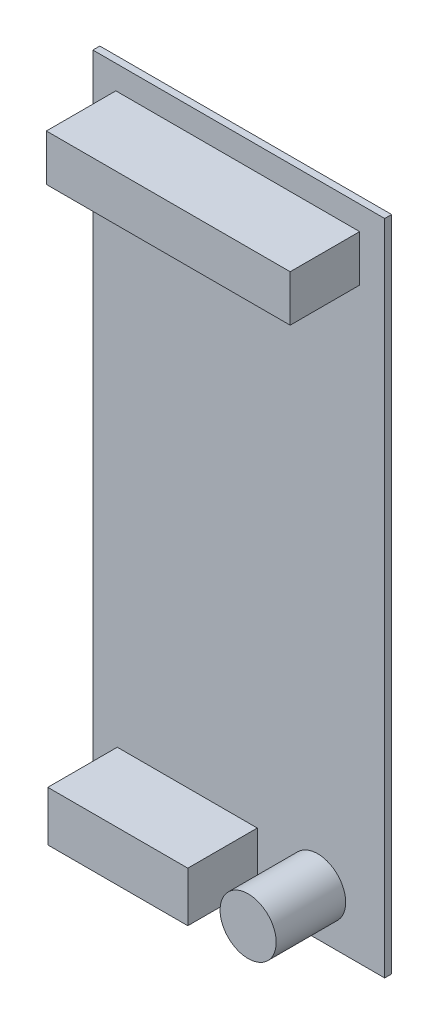
ISO-10303-21;
HEADER;
FILE_DESCRIPTION(('STEP AP214'),'2;1');
FILE_NAME('part.step','',(''),(''),'','','');
FILE_SCHEMA(('AUTOMOTIVE_DESIGN { 1 0 10303 214 1 1 1 1 }'));
ENDSEC;
DATA;
#1=APPLICATION_CONTEXT('core data for automotive mechanical design processes');
#2=APPLICATION_PROTOCOL_DEFINITION('international standard','automotive_design',2000,#1);
#3=PRODUCT_CONTEXT('',#1,'mechanical');
#4=PRODUCT('Part','Part','',(#3));
#5=PRODUCT_RELATED_PRODUCT_CATEGORY('part','',(#4));
#6=PRODUCT_DEFINITION_FORMATION('','',#4);
#7=PRODUCT_DEFINITION_CONTEXT('part definition',#1,'design');
#8=PRODUCT_DEFINITION('design','',#6,#7);
#9=PRODUCT_DEFINITION_SHAPE('','',#8);
#10=(LENGTH_UNIT() NAMED_UNIT(*) SI_UNIT(.MILLI.,.METRE.));
#11=(NAMED_UNIT(*) PLANE_ANGLE_UNIT() SI_UNIT($,.RADIAN.));
#12=(NAMED_UNIT(*) SI_UNIT($,.STERADIAN.) SOLID_ANGLE_UNIT());
#13=UNCERTAINTY_MEASURE_WITH_UNIT(LENGTH_MEASURE(1.E-05),#10,'distance_accuracy_value','');
#14=(GEOMETRIC_REPRESENTATION_CONTEXT(3) GLOBAL_UNCERTAINTY_ASSIGNED_CONTEXT((#13)) GLOBAL_UNIT_ASSIGNED_CONTEXT((#10,
#11,#12)) REPRESENTATION_CONTEXT('',''));
#15=CARTESIAN_POINT('',(0.,0.,0.));
#16=DIRECTION('',(0.,0.,1.));
#17=DIRECTION('',(1.,0.,0.));
#18=AXIS2_PLACEMENT_3D('',#15,#16,#17);
#19=CARTESIAN_POINT('',(0.,0.,0.75));
#20=DIRECTION('',(0.,0.,1.));
#21=DIRECTION('',(1.,0.,0.));
#22=AXIS2_PLACEMENT_3D('',#19,#20,#21);
#23=PLANE('',#22);
#24=CARTESIAN_POINT('',(17.0231668238773,-61.057583046866,0.75));
#25=DIRECTION('',(0.,0.,1.));
#26=DIRECTION('',(1.,0.,0.));
#27=AXIS2_PLACEMENT_3D('',#24,#25,#26);
#28=CIRCLE('',#27,6.05981782966599);
#29=CARTESIAN_POINT('',(23.0829846535433,-61.057583046866,0.75));
#30=VERTEX_POINT('',#29);
#31=EDGE_CURVE('E448',#30,#30,#28,.T.);
#32=ORIENTED_EDGE('',*,*,#31,.F.);
#33=EDGE_LOOP('',(#32));
#34=FACE_BOUND('',#33,.T.);
#35=DIRECTION('',(0.,1.,0.));
#36=VECTOR('',#35,1.);
#37=CARTESIAN_POINT('',(31.5,71.,0.75));
#38=LINE('',#37,#36);
#39=CARTESIAN_POINT('',(31.5,-71.,0.75));
#40=VERTEX_POINT('',#39);
#41=CARTESIAN_POINT('',(31.5,71.,0.75));
#42=VERTEX_POINT('',#41);
#43=EDGE_CURVE('E224',#40,#42,#38,.T.);
#44=ORIENTED_EDGE('',*,*,#43,.T.);
#45=DIRECTION('',(-1.,0.,0.));
#46=VECTOR('',#45,1.);
#47=CARTESIAN_POINT('',(-31.5,71.,0.75));
#48=LINE('',#47,#46);
#49=CARTESIAN_POINT('',(-31.5,71.,0.75));
#50=VERTEX_POINT('',#49);
#51=EDGE_CURVE('E228',#42,#50,#48,.T.);
#52=ORIENTED_EDGE('',*,*,#51,.T.);
#53=DIRECTION('',(0.,-1.,0.));
#54=VECTOR('',#53,1.);
#55=CARTESIAN_POINT('',(-31.5,71.,0.75));
#56=LINE('',#55,#54);
#57=CARTESIAN_POINT('',(-31.5,-71.,0.75));
#58=VERTEX_POINT('',#57);
#59=EDGE_CURVE('E232',#50,#58,#56,.T.);
#60=ORIENTED_EDGE('',*,*,#59,.T.);
#61=DIRECTION('',(1.,0.,0.));
#62=VECTOR('',#61,1.);
#63=CARTESIAN_POINT('',(-31.5,-71.,0.75));
#64=LINE('',#63,#62);
#65=EDGE_CURVE('E235',#58,#40,#64,.T.);
#66=ORIENTED_EDGE('',*,*,#65,.T.);
#67=EDGE_LOOP('',(#44,#52,#60,#66));
#68=FACE_BOUND('',#67,.T.);
#69=DIRECTION('',(1.,0.,0.));
#70=VECTOR('',#69,1.);
#71=CARTESIAN_POINT('',(-26.5363876193413,55.8464095293525,0.75));
#72=LINE('',#71,#70);
#73=CARTESIAN_POINT('',(-26.5363876193413,55.8464095293525,0.75));
#74=VERTEX_POINT('',#73);
#75=CARTESIAN_POINT('',(26.0964649075446,55.8464095293525,0.75));
#76=VERTEX_POINT('',#75);
#77=EDGE_CURVE('E184',#74,#76,#72,.T.);
#78=ORIENTED_EDGE('',*,*,#77,.F.);
#79=DIRECTION('',(0.,-1.,0.));
#80=VECTOR('',#79,1.);
#81=CARTESIAN_POINT('',(-26.5363876193413,65.8464095293525,0.75));
#82=LINE('',#81,#80);
#83=CARTESIAN_POINT('',(-26.5363876193413,65.8464095293525,0.75));
#84=VERTEX_POINT('',#83);
#85=EDGE_CURVE('E180',#84,#74,#82,.T.);
#86=ORIENTED_EDGE('',*,*,#85,.F.);
#87=DIRECTION('',(-1.,0.,0.));
#88=VECTOR('',#87,1.);
#89=CARTESIAN_POINT('',(-26.5363876193413,65.8464095293525,0.75));
#90=LINE('',#89,#88);
#91=CARTESIAN_POINT('',(26.0964649075446,65.8464095293525,0.75));
#92=VERTEX_POINT('',#91);
#93=EDGE_CURVE('E195',#92,#84,#90,.T.);
#94=ORIENTED_EDGE('',*,*,#93,.F.);
#95=DIRECTION('',(0.,1.,0.));
#96=VECTOR('',#95,1.);
#97=CARTESIAN_POINT('',(26.0964649075446,65.8464095293525,0.75));
#98=LINE('',#97,#96);
#99=EDGE_CURVE('E206',#76,#92,#98,.T.);
#100=ORIENTED_EDGE('',*,*,#99,.F.);
#101=EDGE_LOOP('',(#78,#86,#94,#100));
#102=FACE_BOUND('',#101,.T.);
#103=DIRECTION('',(1.,0.,0.));
#104=VECTOR('',#103,1.);
#105=CARTESIAN_POINT('',(-26.2295733714844,-67.4846970517992,0.75));
#106=LINE('',#105,#104);
#107=CARTESIAN_POINT('',(-26.2295733714844,-67.4846970517992,0.75));
#108=VERTEX_POINT('',#107);
#109=CARTESIAN_POINT('',(3.99523303009364,-67.4846970517992,0.75));
#110=VERTEX_POINT('',#109);
#111=EDGE_CURVE('E460',#108,#110,#106,.T.);
#112=ORIENTED_EDGE('',*,*,#111,.F.);
#113=DIRECTION('',(0.,-1.,0.));
#114=VECTOR('',#113,1.);
#115=CARTESIAN_POINT('',(-26.2295733714844,-56.7149384489381,0.75));
#116=LINE('',#115,#114);
#117=CARTESIAN_POINT('',(-26.2295733714844,-56.7149384489381,0.75));
#118=VERTEX_POINT('',#117);
#119=EDGE_CURVE('E178',#118,#108,#116,.T.);
#120=ORIENTED_EDGE('',*,*,#119,.F.);
#121=DIRECTION('',(-1.,0.,0.));
#122=VECTOR('',#121,1.);
#123=CARTESIAN_POINT('',(-26.2295733714844,-56.7149384489381,0.75));
#124=LINE('',#123,#122);
#125=CARTESIAN_POINT('',(3.99523303009364,-56.7149384489381,0.75));
#126=VERTEX_POINT('',#125);
#127=EDGE_CURVE('E174',#126,#118,#124,.T.);
#128=ORIENTED_EDGE('',*,*,#127,.F.);
#129=DIRECTION('',(0.,1.,0.));
#130=VECTOR('',#129,1.);
#131=CARTESIAN_POINT('',(3.99523303009364,-56.7149384489381,0.75));
#132=LINE('',#131,#130);
#133=EDGE_CURVE('E463',#110,#126,#132,.T.);
#134=ORIENTED_EDGE('',*,*,#133,.F.);
#135=EDGE_LOOP('',(#112,#120,#128,#134));
#136=FACE_BOUND('',#135,.T.);
#137=ADVANCED_FACE('F47',(#34,#68,#102,#136),#23,.T.);
#138=CARTESIAN_POINT('',(31.5,71.,0.75));
#139=DIRECTION('',(-1.,0.,0.));
#140=DIRECTION('',(0.,-1.,0.));
#141=AXIS2_PLACEMENT_3D('',#138,#139,#140);
#142=PLANE('',#141);
#143=DIRECTION('',(0.,1.,0.));
#144=VECTOR('',#143,1.);
#145=CARTESIAN_POINT('',(31.5,71.,-0.75));
#146=LINE('',#145,#144);
#147=CARTESIAN_POINT('',(31.5,-71.,-0.75));
#148=VERTEX_POINT('',#147);
#149=CARTESIAN_POINT('',(31.5,71.,-0.75));
#150=VERTEX_POINT('',#149);
#151=EDGE_CURVE('E223',#148,#150,#146,.T.);
#152=ORIENTED_EDGE('',*,*,#151,.T.);
#153=DIRECTION('',(0.,0.,-1.));
#154=VECTOR('',#153,1.);
#155=CARTESIAN_POINT('',(31.5,71.,0.75));
#156=LINE('',#155,#154);
#157=EDGE_CURVE('E11',#42,#150,#156,.T.);
#158=ORIENTED_EDGE('',*,*,#157,.F.);
#159=ORIENTED_EDGE('',*,*,#43,.F.);
#160=DIRECTION('',(0.,0.,-1.));
#161=VECTOR('',#160,1.);
#162=CARTESIAN_POINT('',(31.5,-71.,0.75));
#163=LINE('',#162,#161);
#164=EDGE_CURVE('E238',#40,#148,#163,.T.);
#165=ORIENTED_EDGE('',*,*,#164,.T.);
#166=EDGE_LOOP('',(#152,#158,#159,#165));
#167=FACE_BOUND('',#166,.T.);
#168=ADVANCED_FACE('F49',(#167),#142,.F.);
#169=CARTESIAN_POINT('',(-31.5,71.,0.75));
#170=DIRECTION('',(0.,-1.,0.));
#171=DIRECTION('',(0.,0.,-1.));
#172=AXIS2_PLACEMENT_3D('',#169,#170,#171);
#173=PLANE('',#172);
#174=DIRECTION('',(-1.,0.,0.));
#175=VECTOR('',#174,1.);
#176=CARTESIAN_POINT('',(-31.5,71.,-0.75));
#177=LINE('',#176,#175);
#178=CARTESIAN_POINT('',(-31.5,71.,-0.75));
#179=VERTEX_POINT('',#178);
#180=EDGE_CURVE('E242',#150,#179,#177,.T.);
#181=ORIENTED_EDGE('',*,*,#180,.T.);
#182=DIRECTION('',(0.,0.,-1.));
#183=VECTOR('',#182,1.);
#184=CARTESIAN_POINT('',(-31.5,71.,0.75));
#185=LINE('',#184,#183);
#186=EDGE_CURVE('E56',#50,#179,#185,.T.);
#187=ORIENTED_EDGE('',*,*,#186,.F.);
#188=ORIENTED_EDGE('',*,*,#51,.F.);
#189=ORIENTED_EDGE('',*,*,#157,.T.);
#190=EDGE_LOOP('',(#181,#187,#188,#189));
#191=FACE_BOUND('',#190,.T.);
#192=ADVANCED_FACE('F276',(#191),#173,.F.);
#193=CARTESIAN_POINT('',(-31.5,71.,0.75));
#194=DIRECTION('',(1.,0.,0.));
#195=DIRECTION('',(0.,1.,0.));
#196=AXIS2_PLACEMENT_3D('',#193,#194,#195);
#197=PLANE('',#196);
#198=DIRECTION('',(0.,-1.,0.));
#199=VECTOR('',#198,1.);
#200=CARTESIAN_POINT('',(-31.5,71.,-0.75));
#201=LINE('',#200,#199);
#202=CARTESIAN_POINT('',(-31.5,-71.,-0.75));
#203=VERTEX_POINT('',#202);
#204=EDGE_CURVE('E245',#179,#203,#201,.T.);
#205=ORIENTED_EDGE('',*,*,#204,.T.);
#206=DIRECTION('',(0.,0.,-1.));
#207=VECTOR('',#206,1.);
#208=CARTESIAN_POINT('',(-31.5,-71.,0.75));
#209=LINE('',#208,#207);
#210=EDGE_CURVE('E253',#58,#203,#209,.T.);
#211=ORIENTED_EDGE('',*,*,#210,.F.);
#212=ORIENTED_EDGE('',*,*,#59,.F.);
#213=ORIENTED_EDGE('',*,*,#186,.T.);
#214=EDGE_LOOP('',(#205,#211,#212,#213));
#215=FACE_BOUND('',#214,.T.);
#216=ADVANCED_FACE('F260',(#215),#197,.F.);
#217=CARTESIAN_POINT('',(-31.5,-71.,0.75));
#218=DIRECTION('',(0.,1.,0.));
#219=DIRECTION('',(0.,0.,1.));
#220=AXIS2_PLACEMENT_3D('',#217,#218,#219);
#221=PLANE('',#220);
#222=DIRECTION('',(1.,0.,0.));
#223=VECTOR('',#222,1.);
#224=CARTESIAN_POINT('',(-31.5,-71.,-0.75));
#225=LINE('',#224,#223);
#226=EDGE_CURVE('E229',#203,#148,#225,.T.);
#227=ORIENTED_EDGE('',*,*,#226,.T.);
#228=ORIENTED_EDGE('',*,*,#164,.F.);
#229=ORIENTED_EDGE('',*,*,#65,.F.);
#230=ORIENTED_EDGE('',*,*,#210,.T.);
#231=EDGE_LOOP('',(#227,#228,#229,#230));
#232=FACE_BOUND('',#231,.T.);
#233=ADVANCED_FACE('F269',(#232),#221,.F.);
#234=CARTESIAN_POINT('',(0.,0.,-0.75));
#235=DIRECTION('',(0.,0.,1.));
#236=DIRECTION('',(1.,0.,0.));
#237=AXIS2_PLACEMENT_3D('',#234,#235,#236);
#238=PLANE('',#237);
#239=ORIENTED_EDGE('',*,*,#151,.F.);
#240=ORIENTED_EDGE('',*,*,#226,.F.);
#241=ORIENTED_EDGE('',*,*,#204,.F.);
#242=ORIENTED_EDGE('',*,*,#180,.F.);
#243=EDGE_LOOP('',(#239,#240,#241,#242));
#244=FACE_BOUND('',#243,.T.);
#245=ADVANCED_FACE('F266',(#244),#238,.F.);
#246=CARTESIAN_POINT('',(-26.5363876193413,65.8464095293525,15.75));
#247=DIRECTION('',(1.,0.,0.));
#248=DIRECTION('',(0.,0.,-1.));
#249=AXIS2_PLACEMENT_3D('',#246,#247,#248);
#250=PLANE('',#249);
#251=ORIENTED_EDGE('',*,*,#85,.T.);
#252=DIRECTION('',(0.,0.,-1.));
#253=VECTOR('',#252,1.);
#254=CARTESIAN_POINT('',(-26.5363876193413,55.8464095293525,15.75));
#255=LINE('',#254,#253);
#256=CARTESIAN_POINT('',(-26.5363876193413,55.8464095293525,15.75));
#257=VERTEX_POINT('',#256);
#258=EDGE_CURVE('E220',#257,#74,#255,.T.);
#259=ORIENTED_EDGE('',*,*,#258,.F.);
#260=DIRECTION('',(0.,-1.,0.));
#261=VECTOR('',#260,1.);
#262=CARTESIAN_POINT('',(-26.5363876193413,65.8464095293525,15.75));
#263=LINE('',#262,#261);
#264=CARTESIAN_POINT('',(-26.5363876193413,65.8464095293525,15.75));
#265=VERTEX_POINT('',#264);
#266=EDGE_CURVE('E190',#265,#257,#263,.T.);
#267=ORIENTED_EDGE('',*,*,#266,.F.);
#268=DIRECTION('',(0.,0.,-1.));
#269=VECTOR('',#268,1.);
#270=CARTESIAN_POINT('',(-26.5363876193413,65.8464095293525,15.75));
#271=LINE('',#270,#269);
#272=EDGE_CURVE('E202',#265,#84,#271,.T.);
#273=ORIENTED_EDGE('',*,*,#272,.T.);
#274=EDGE_LOOP('',(#251,#259,#267,#273));
#275=FACE_BOUND('',#274,.T.);
#276=ADVANCED_FACE('F292',(#275),#250,.F.);
#277=CARTESIAN_POINT('',(-26.5363876193413,55.8464095293525,15.75));
#278=DIRECTION('',(0.,1.,0.));
#279=DIRECTION('',(0.,0.,1.));
#280=AXIS2_PLACEMENT_3D('',#277,#278,#279);
#281=PLANE('',#280);
#282=ORIENTED_EDGE('',*,*,#77,.T.);
#283=DIRECTION('',(0.,0.,-1.));
#284=VECTOR('',#283,1.);
#285=CARTESIAN_POINT('',(26.0964649075446,55.8464095293525,15.75));
#286=LINE('',#285,#284);
#287=CARTESIAN_POINT('',(26.0964649075446,55.8464095293525,15.75));
#288=VERTEX_POINT('',#287);
#289=EDGE_CURVE('E216',#288,#76,#286,.T.);
#290=ORIENTED_EDGE('',*,*,#289,.F.);
#291=DIRECTION('',(1.,0.,0.));
#292=VECTOR('',#291,1.);
#293=CARTESIAN_POINT('',(-26.5363876193413,55.8464095293525,15.75));
#294=LINE('',#293,#292);
#295=EDGE_CURVE('E194',#257,#288,#294,.T.);
#296=ORIENTED_EDGE('',*,*,#295,.F.);
#297=ORIENTED_EDGE('',*,*,#258,.T.);
#298=EDGE_LOOP('',(#282,#290,#296,#297));
#299=FACE_BOUND('',#298,.T.);
#300=ADVANCED_FACE('F314',(#299),#281,.F.);
#301=CARTESIAN_POINT('',(26.0964649075446,65.8464095293525,15.75));
#302=DIRECTION('',(-1.,0.,0.));
#303=DIRECTION('',(0.,0.,1.));
#304=AXIS2_PLACEMENT_3D('',#301,#302,#303);
#305=PLANE('',#304);
#306=ORIENTED_EDGE('',*,*,#99,.T.);
#307=DIRECTION('',(0.,0.,-1.));
#308=VECTOR('',#307,1.);
#309=CARTESIAN_POINT('',(26.0964649075446,65.8464095293525,15.75));
#310=LINE('',#309,#308);
#311=CARTESIAN_POINT('',(26.0964649075446,65.8464095293525,15.75));
#312=VERTEX_POINT('',#311);
#313=EDGE_CURVE('E77',#312,#92,#310,.T.);
#314=ORIENTED_EDGE('',*,*,#313,.F.);
#315=DIRECTION('',(0.,1.,0.));
#316=VECTOR('',#315,1.);
#317=CARTESIAN_POINT('',(26.0964649075446,65.8464095293525,15.75));
#318=LINE('',#317,#316);
#319=EDGE_CURVE('E198',#288,#312,#318,.T.);
#320=ORIENTED_EDGE('',*,*,#319,.F.);
#321=ORIENTED_EDGE('',*,*,#289,.T.);
#322=EDGE_LOOP('',(#306,#314,#320,#321));
#323=FACE_BOUND('',#322,.T.);
#324=ADVANCED_FACE('F308',(#323),#305,.F.);
#325=CARTESIAN_POINT('',(-26.5363876193413,65.8464095293525,15.75));
#326=DIRECTION('',(0.,-1.,0.));
#327=DIRECTION('',(0.,0.,-1.));
#328=AXIS2_PLACEMENT_3D('',#325,#326,#327);
#329=PLANE('',#328);
#330=ORIENTED_EDGE('',*,*,#93,.T.);
#331=ORIENTED_EDGE('',*,*,#272,.F.);
#332=DIRECTION('',(-1.,0.,0.));
#333=VECTOR('',#332,1.);
#334=CARTESIAN_POINT('',(-26.5363876193413,65.8464095293525,15.75));
#335=LINE('',#334,#333);
#336=EDGE_CURVE('E200',#312,#265,#335,.T.);
#337=ORIENTED_EDGE('',*,*,#336,.F.);
#338=ORIENTED_EDGE('',*,*,#313,.T.);
#339=EDGE_LOOP('',(#330,#331,#337,#338));
#340=FACE_BOUND('',#339,.T.);
#341=ADVANCED_FACE('F304',(#340),#329,.F.);
#342=CARTESIAN_POINT('',(0.,0.,15.75));
#343=DIRECTION('',(0.,0.,1.));
#344=DIRECTION('',(1.,0.,0.));
#345=AXIS2_PLACEMENT_3D('',#342,#343,#344);
#346=PLANE('',#345);
#347=ORIENTED_EDGE('',*,*,#266,.T.);
#348=ORIENTED_EDGE('',*,*,#295,.T.);
#349=ORIENTED_EDGE('',*,*,#319,.T.);
#350=ORIENTED_EDGE('',*,*,#336,.T.);
#351=EDGE_LOOP('',(#347,#348,#349,#350));
#352=FACE_BOUND('',#351,.T.);
#353=ADVANCED_FACE('F307',(#352),#346,.T.);
#354=CARTESIAN_POINT('',(-26.2295733714844,-56.7149384489381,15.75));
#355=DIRECTION('',(1.,0.,0.));
#356=DIRECTION('',(0.,0.,-1.));
#357=AXIS2_PLACEMENT_3D('',#354,#355,#356);
#358=PLANE('',#357);
#359=ORIENTED_EDGE('',*,*,#119,.T.);
#360=DIRECTION('',(0.,0.,-1.));
#361=VECTOR('',#360,1.);
#362=CARTESIAN_POINT('',(-26.2295733714844,-67.4846970517992,15.75));
#363=LINE('',#362,#361);
#364=CARTESIAN_POINT('',(-26.2295733714844,-67.4846970517992,15.75));
#365=VERTEX_POINT('',#364);
#366=EDGE_CURVE('E157',#365,#108,#363,.T.);
#367=ORIENTED_EDGE('',*,*,#366,.F.);
#368=DIRECTION('',(0.,-1.,0.));
#369=VECTOR('',#368,1.);
#370=CARTESIAN_POINT('',(-26.2295733714844,-56.7149384489381,15.75));
#371=LINE('',#370,#369);
#372=CARTESIAN_POINT('',(-26.2295733714844,-56.7149384489381,15.75));
#373=VERTEX_POINT('',#372);
#374=EDGE_CURVE('E165',#373,#365,#371,.T.);
#375=ORIENTED_EDGE('',*,*,#374,.F.);
#376=DIRECTION('',(0.,0.,-1.));
#377=VECTOR('',#376,1.);
#378=CARTESIAN_POINT('',(-26.2295733714844,-56.7149384489381,15.75));
#379=LINE('',#378,#377);
#380=EDGE_CURVE('E458',#373,#118,#379,.T.);
#381=ORIENTED_EDGE('',*,*,#380,.T.);
#382=EDGE_LOOP('',(#359,#367,#375,#381));
#383=FACE_BOUND('',#382,.T.);
#384=ADVANCED_FACE('F176',(#383),#358,.F.);
#385=CARTESIAN_POINT('',(-26.2295733714844,-67.4846970517992,15.75));
#386=DIRECTION('',(0.,1.,0.));
#387=DIRECTION('',(0.,0.,1.));
#388=AXIS2_PLACEMENT_3D('',#385,#386,#387);
#389=PLANE('',#388);
#390=ORIENTED_EDGE('',*,*,#111,.T.);
#391=DIRECTION('',(0.,0.,-1.));
#392=VECTOR('',#391,1.);
#393=CARTESIAN_POINT('',(3.99523303009364,-67.4846970517992,15.75));
#394=LINE('',#393,#392);
#395=CARTESIAN_POINT('',(3.99523303009364,-67.4846970517992,15.75));
#396=VERTEX_POINT('',#395);
#397=EDGE_CURVE('E160',#396,#110,#394,.T.);
#398=ORIENTED_EDGE('',*,*,#397,.F.);
#399=DIRECTION('',(1.,0.,0.));
#400=VECTOR('',#399,1.);
#401=CARTESIAN_POINT('',(-26.2295733714844,-67.4846970517992,15.75));
#402=LINE('',#401,#400);
#403=EDGE_CURVE('E153',#365,#396,#402,.T.);
#404=ORIENTED_EDGE('',*,*,#403,.F.);
#405=ORIENTED_EDGE('',*,*,#366,.T.);
#406=EDGE_LOOP('',(#390,#398,#404,#405));
#407=FACE_BOUND('',#406,.T.);
#408=ADVANCED_FACE('F155',(#407),#389,.F.);
#409=CARTESIAN_POINT('',(3.99523303009364,-56.7149384489381,15.75));
#410=DIRECTION('',(-1.,0.,0.));
#411=DIRECTION('',(0.,0.,1.));
#412=AXIS2_PLACEMENT_3D('',#409,#410,#411);
#413=PLANE('',#412);
#414=ORIENTED_EDGE('',*,*,#133,.T.);
#415=DIRECTION('',(0.,0.,-1.));
#416=VECTOR('',#415,1.);
#417=CARTESIAN_POINT('',(3.99523303009364,-56.7149384489381,15.75));
#418=LINE('',#417,#416);
#419=CARTESIAN_POINT('',(3.99523303009364,-56.7149384489381,15.75));
#420=VERTEX_POINT('',#419);
#421=EDGE_CURVE('E66',#420,#126,#418,.T.);
#422=ORIENTED_EDGE('',*,*,#421,.F.);
#423=DIRECTION('',(0.,1.,0.));
#424=VECTOR('',#423,1.);
#425=CARTESIAN_POINT('',(3.99523303009364,-56.7149384489381,15.75));
#426=LINE('',#425,#424);
#427=EDGE_CURVE('E164',#396,#420,#426,.T.);
#428=ORIENTED_EDGE('',*,*,#427,.F.);
#429=ORIENTED_EDGE('',*,*,#397,.T.);
#430=EDGE_LOOP('',(#414,#422,#428,#429));
#431=FACE_BOUND('',#430,.T.);
#432=ADVANCED_FACE('F397',(#431),#413,.F.);
#433=CARTESIAN_POINT('',(-26.2295733714844,-56.7149384489381,15.75));
#434=DIRECTION('',(0.,-1.,0.));
#435=DIRECTION('',(0.,0.,-1.));
#436=AXIS2_PLACEMENT_3D('',#433,#434,#435);
#437=PLANE('',#436);
#438=ORIENTED_EDGE('',*,*,#127,.T.);
#439=ORIENTED_EDGE('',*,*,#380,.F.);
#440=DIRECTION('',(-1.,0.,0.));
#441=VECTOR('',#440,1.);
#442=CARTESIAN_POINT('',(-26.2295733714844,-56.7149384489381,15.75));
#443=LINE('',#442,#441);
#444=EDGE_CURVE('E169',#420,#373,#443,.T.);
#445=ORIENTED_EDGE('',*,*,#444,.F.);
#446=ORIENTED_EDGE('',*,*,#421,.T.);
#447=EDGE_LOOP('',(#438,#439,#445,#446));
#448=FACE_BOUND('',#447,.T.);
#449=ADVANCED_FACE('F406',(#448),#437,.F.);
#450=CARTESIAN_POINT('',(0.,0.,15.75));
#451=DIRECTION('',(0.,0.,1.));
#452=DIRECTION('',(1.,0.,0.));
#453=AXIS2_PLACEMENT_3D('',#450,#451,#452);
#454=PLANE('',#453);
#455=ORIENTED_EDGE('',*,*,#374,.T.);
#456=ORIENTED_EDGE('',*,*,#403,.T.);
#457=ORIENTED_EDGE('',*,*,#427,.T.);
#458=ORIENTED_EDGE('',*,*,#444,.T.);
#459=EDGE_LOOP('',(#455,#456,#457,#458));
#460=FACE_BOUND('',#459,.T.);
#461=ADVANCED_FACE('F168',(#460),#454,.T.);
#462=CARTESIAN_POINT('',(17.0231668238773,-61.057583046866,15.75));
#463=DIRECTION('',(0.,0.,-1.));
#464=DIRECTION('',(-1.,0.,0.));
#465=AXIS2_PLACEMENT_3D('',#462,#463,#464);
#466=CYLINDRICAL_SURFACE('',#465,6.05981782966599);
#467=CARTESIAN_POINT('',(17.0231668238773,-61.057583046866,15.75));
#468=DIRECTION('',(0.,0.,1.));
#469=DIRECTION('',(1.,0.,0.));
#470=AXIS2_PLACEMENT_3D('',#467,#468,#469);
#471=CIRCLE('',#470,6.05981782966599);
#472=CARTESIAN_POINT('',(23.0829846535433,-61.057583046866,15.75));
#473=VERTEX_POINT('',#472);
#474=EDGE_CURVE('E446',#473,#473,#471,.T.);
#475=ORIENTED_EDGE('',*,*,#474,.F.);
#476=EDGE_LOOP('',(#475));
#477=FACE_BOUND('',#476,.T.);
#478=ORIENTED_EDGE('',*,*,#31,.T.);
#479=EDGE_LOOP('',(#478));
#480=FACE_BOUND('',#479,.T.);
#481=ADVANCED_FACE('F302',(#477,#480),#466,.T.);
#482=CARTESIAN_POINT('',(17.0231668238773,-61.057583046866,15.75));
#483=DIRECTION('',(0.,0.,1.));
#484=DIRECTION('',(1.,0.,0.));
#485=AXIS2_PLACEMENT_3D('',#482,#483,#484);
#486=PLANE('',#485);
#487=ORIENTED_EDGE('',*,*,#474,.T.);
#488=EDGE_LOOP('',(#487));
#489=FACE_BOUND('',#488,.T.);
#490=ADVANCED_FACE('F431',(#489),#486,.T.);
#491=CLOSED_SHELL('',(#137,#168,#192,#216,#233,#245,#276,#300,#324,#341,#353,#384,#408,#432,
#449,#461,#481,#490));
#492=MANIFOLD_SOLID_BREP('B2',#491);
#493=ADVANCED_BREP_SHAPE_REPRESENTATION('',(#18,#492),#14);
#494=SHAPE_DEFINITION_REPRESENTATION(#9,#493);
ENDSEC;
END-ISO-10303-21;
